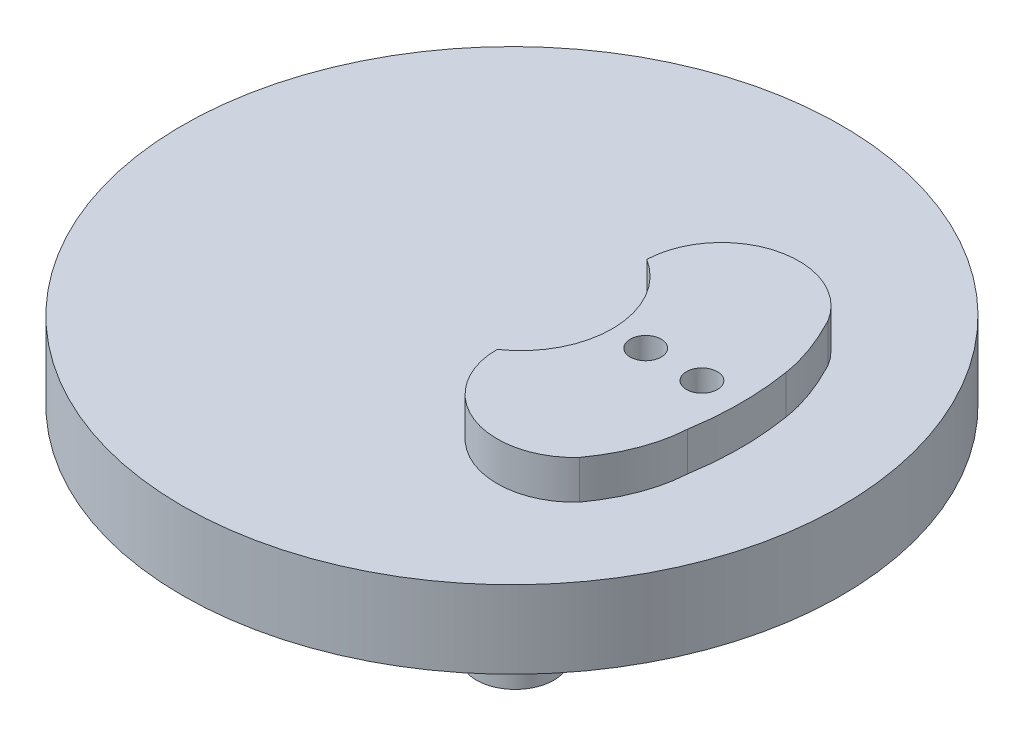
ISO-10303-21;
HEADER;
FILE_DESCRIPTION(('STEP AP214'),'2;1');
FILE_NAME('part.step','',(''),(''),'','','');
FILE_SCHEMA(('AUTOMOTIVE_DESIGN { 1 0 10303 214 1 1 1 1 }'));
ENDSEC;
DATA;
#1=APPLICATION_CONTEXT('core data for automotive mechanical design processes');
#2=APPLICATION_PROTOCOL_DEFINITION('international standard','automotive_design',2000,#1);
#3=PRODUCT_CONTEXT('',#1,'mechanical');
#4=PRODUCT('Part','Part','',(#3));
#5=PRODUCT_RELATED_PRODUCT_CATEGORY('part','',(#4));
#6=PRODUCT_DEFINITION_FORMATION('','',#4);
#7=PRODUCT_DEFINITION_CONTEXT('part definition',#1,'design');
#8=PRODUCT_DEFINITION('design','',#6,#7);
#9=PRODUCT_DEFINITION_SHAPE('','',#8);
#10=(LENGTH_UNIT() NAMED_UNIT(*) SI_UNIT(.MILLI.,.METRE.));
#11=(NAMED_UNIT(*) PLANE_ANGLE_UNIT() SI_UNIT($,.RADIAN.));
#12=(NAMED_UNIT(*) SI_UNIT($,.STERADIAN.) SOLID_ANGLE_UNIT());
#13=UNCERTAINTY_MEASURE_WITH_UNIT(LENGTH_MEASURE(1.E-05),#10,'distance_accuracy_value','');
#14=(GEOMETRIC_REPRESENTATION_CONTEXT(3) GLOBAL_UNCERTAINTY_ASSIGNED_CONTEXT((#13)) GLOBAL_UNIT_ASSIGNED_CONTEXT((#10,
#11,#12)) REPRESENTATION_CONTEXT('',''));
#15=CARTESIAN_POINT('',(0.,0.,0.));
#16=DIRECTION('',(0.,0.,1.));
#17=DIRECTION('',(1.,0.,0.));
#18=AXIS2_PLACEMENT_3D('',#15,#16,#17);
#19=CARTESIAN_POINT('',(0.,10.,0.));
#20=DIRECTION('',(0.,1.,0.));
#21=DIRECTION('',(0.,0.,1.));
#22=AXIS2_PLACEMENT_3D('',#19,#20,#21);
#23=PLANE('',#22);
#24=CARTESIAN_POINT('',(0.,10.,0.));
#25=DIRECTION('',(0.,1.,0.));
#26=DIRECTION('',(0.,0.,1.));
#27=AXIS2_PLACEMENT_3D('',#24,#25,#26);
#28=CIRCLE('',#27,42.5);
#29=CARTESIAN_POINT('',(0.,10.,42.5));
#30=VERTEX_POINT('',#29);
#31=EDGE_CURVE('E206',#30,#30,#28,.T.);
#32=ORIENTED_EDGE('',*,*,#31,.T.);
#33=EDGE_LOOP('',(#32));
#34=FACE_BOUND('',#33,.T.);
#35=CARTESIAN_POINT('',(29.,10.,6.35));
#36=CARTESIAN_POINT('',(28.6990503841167,10.,11.6004540782716));
#37=CARTESIAN_POINT('',(25.1780473542711,10.,16.4865917587496));
#38=B_SPLINE_CURVE_WITH_KNOTS('',2,(#35,#36,#37),.UNSPECIFIED.,.F.,.F.,(3,3),(0.672682650204616,
1.),.UNSPECIFIED.);
#39=CARTESIAN_POINT('',(29.,10.,6.35));
#40=VERTEX_POINT('',#39);
#41=CARTESIAN_POINT('',(25.1780473542711,10.,16.4865917587496));
#42=VERTEX_POINT('',#41);
#43=EDGE_CURVE('E142',#40,#42,#38,.T.);
#44=ORIENTED_EDGE('',*,*,#43,.T.);
#45=CARTESIAN_POINT('',(17.8151445831458,10.,9.71993358924264));
#46=DIRECTION('',(0.,1.,0.));
#47=DIRECTION('',(0.,0.,1.));
#48=AXIS2_PLACEMENT_3D('',#45,#46,#47);
#49=CIRCLE('',#48,9.99999999999999);
#50=CARTESIAN_POINT('',(7.81514458314579,10.,9.71993358924264));
#51=VERTEX_POINT('',#50);
#52=EDGE_CURVE('E174',#51,#42,#49,.T.);
#53=ORIENTED_EDGE('',*,*,#52,.F.);
#54=CARTESIAN_POINT('',(1.16155873490869,10.,0.));
#55=DIRECTION('',(0.,1.,0.));
#56=DIRECTION('',(0.,0.,1.));
#57=AXIS2_PLACEMENT_3D('',#54,#55,#56);
#58=CIRCLE('',#57,11.7791049583213);
#59=CARTESIAN_POINT('',(7.41061008423523,10.,-9.98482202408379));
#60=VERTEX_POINT('',#59);
#61=EDGE_CURVE('E61',#51,#60,#58,.T.);
#62=ORIENTED_EDGE('',*,*,#61,.T.);
#63=CARTESIAN_POINT('',(17.403624831824,10.,-9.61111591700208));
#64=DIRECTION('',(0.,1.,0.));
#65=DIRECTION('',(0.,0.,1.));
#66=AXIS2_PLACEMENT_3D('',#63,#64,#65);
#67=CIRCLE('',#66,9.99999999999982);
#68=CARTESIAN_POINT('',(25.955774389859,10.,-14.7938505172878));
#69=VERTEX_POINT('',#68);
#70=EDGE_CURVE('E122',#69,#60,#67,.T.);
#71=ORIENTED_EDGE('',*,*,#70,.F.);
#72=CARTESIAN_POINT('',(25.9557743898593,10.,-14.7938505172879));
#73=CARTESIAN_POINT('',(27.3295364248855,10.,-12.1453080062289));
#74=CARTESIAN_POINT('',(28.5408611416074,10.,-9.3136069401987));
#75=CARTESIAN_POINT('',(29.,10.,-6.35));
#76=B_SPLINE_CURVE_WITH_KNOTS('',3,(#72,#73,#74,#75),.UNSPECIFIED.,.F.,.F.,(4,4),(0.,
0.277553495444248),.UNSPECIFIED.);
#77=CARTESIAN_POINT('',(29.,10.,-6.35));
#78=VERTEX_POINT('',#77);
#79=EDGE_CURVE('E158',#69,#78,#76,.T.);
#80=ORIENTED_EDGE('',*,*,#79,.T.);
#81=CARTESIAN_POINT('',(29.,10.,-6.35));
#82=CARTESIAN_POINT('',(30.0422721438966,10.,0.));
#83=CARTESIAN_POINT('',(29.,10.,6.35));
#84=B_SPLINE_CURVE_WITH_KNOTS('',2,(#81,#82,#83),.UNSPECIFIED.,.F.,.F.,(3,3),(0.,1.),.UNSPECIFIED.);
#85=EDGE_CURVE('E148',#78,#40,#84,.T.);
#86=ORIENTED_EDGE('',*,*,#85,.T.);
#87=EDGE_LOOP('',(#44,#53,#62,#71,#80,#86));
#88=FACE_BOUND('',#87,.T.);
#89=ADVANCED_FACE('F45',(#34,#88),#23,.T.);
#90=CARTESIAN_POINT('',(0.,10.,0.));
#91=DIRECTION('',(0.,-1.,0.));
#92=DIRECTION('',(0.,0.,-1.));
#93=AXIS2_PLACEMENT_3D('',#90,#91,#92);
#94=CYLINDRICAL_SURFACE('',#93,42.5);
#95=ORIENTED_EDGE('',*,*,#31,.F.);
#96=EDGE_LOOP('',(#95));
#97=FACE_BOUND('',#96,.T.);
#98=CARTESIAN_POINT('',(0.,0.,0.));
#99=DIRECTION('',(0.,1.,0.));
#100=DIRECTION('',(0.,0.,1.));
#101=AXIS2_PLACEMENT_3D('',#98,#99,#100);
#102=CIRCLE('',#101,42.5);
#103=CARTESIAN_POINT('',(0.,0.,42.5));
#104=VERTEX_POINT('',#103);
#105=EDGE_CURVE('E205',#104,#104,#102,.T.);
#106=ORIENTED_EDGE('',*,*,#105,.T.);
#107=EDGE_LOOP('',(#106));
#108=FACE_BOUND('',#107,.T.);
#109=ADVANCED_FACE('F47',(#97,#108),#94,.T.);
#110=CARTESIAN_POINT('',(0.,0.,0.));
#111=DIRECTION('',(0.,1.,0.));
#112=DIRECTION('',(0.,0.,1.));
#113=AXIS2_PLACEMENT_3D('',#110,#111,#112);
#114=PLANE('',#113);
#115=CARTESIAN_POINT('',(24.5,0.,3.02492406123456E-12));
#116=DIRECTION('',(0.,1.,0.));
#117=DIRECTION('',(0.,0.,1.));
#118=AXIS2_PLACEMENT_3D('',#115,#116,#117);
#119=CIRCLE('',#118,2.00000000000089);
#120=CARTESIAN_POINT('',(24.5,0.,2.00000000000391));
#121=VERTEX_POINT('',#120);
#122=EDGE_CURVE('E513',#121,#121,#119,.T.);
#123=ORIENTED_EDGE('',*,*,#122,.T.);
#124=EDGE_LOOP('',(#123));
#125=FACE_BOUND('',#124,.T.);
#126=CARTESIAN_POINT('',(17.25,0.,0.));
#127=DIRECTION('',(0.,1.,0.));
#128=DIRECTION('',(0.,0.,1.));
#129=AXIS2_PLACEMENT_3D('',#126,#127,#128);
#130=CIRCLE('',#129,2.);
#131=CARTESIAN_POINT('',(17.25,0.,2.));
#132=VERTEX_POINT('',#131);
#133=EDGE_CURVE('E149',#132,#132,#130,.T.);
#134=ORIENTED_EDGE('',*,*,#133,.T.);
#135=EDGE_LOOP('',(#134));
#136=FACE_BOUND('',#135,.T.);
#137=CARTESIAN_POINT('',(-21.4210153985787,0.,-21.0033354325892));
#138=DIRECTION('',(0.,1.,0.));
#139=DIRECTION('',(0.,0.,1.));
#140=AXIS2_PLACEMENT_3D('',#137,#138,#139);
#141=CIRCLE('',#140,5.);
#142=CARTESIAN_POINT('',(-21.4210153985787,0.,-16.0033354325892));
#143=VERTEX_POINT('',#142);
#144=EDGE_CURVE('E11',#143,#143,#141,.F.);
#145=ORIENTED_EDGE('',*,*,#144,.F.);
#146=EDGE_LOOP('',(#145));
#147=FACE_BOUND('',#146,.T.);
#148=CARTESIAN_POINT('',(-21.0033354325894,0.,21.4210153985784));
#149=DIRECTION('',(0.,1.,0.));
#150=DIRECTION('',(0.,0.,1.));
#151=AXIS2_PLACEMENT_3D('',#148,#149,#150);
#152=CIRCLE('',#151,5.);
#153=CARTESIAN_POINT('',(-21.0033354325894,0.,26.4210153985784));
#154=VERTEX_POINT('',#153);
#155=EDGE_CURVE('E54',#154,#154,#152,.F.);
#156=ORIENTED_EDGE('',*,*,#155,.F.);
#157=EDGE_LOOP('',(#156));
#158=FACE_BOUND('',#157,.T.);
#159=CARTESIAN_POINT('',(21.0033354325892,0.,-21.4210153985786));
#160=DIRECTION('',(0.,1.,0.));
#161=DIRECTION('',(0.,0.,1.));
#162=AXIS2_PLACEMENT_3D('',#159,#160,#161);
#163=CIRCLE('',#162,5.);
#164=CARTESIAN_POINT('',(21.0033354325892,0.,-16.4210153985786));
#165=VERTEX_POINT('',#164);
#166=EDGE_CURVE('E217',#165,#165,#163,.F.);
#167=ORIENTED_EDGE('',*,*,#166,.F.);
#168=EDGE_LOOP('',(#167));
#169=FACE_BOUND('',#168,.T.);
#170=CARTESIAN_POINT('',(21.4210153985785,0.,21.0033354325893));
#171=DIRECTION('',(0.,1.,0.));
#172=DIRECTION('',(0.,0.,1.));
#173=AXIS2_PLACEMENT_3D('',#170,#171,#172);
#174=CIRCLE('',#173,5.);
#175=CARTESIAN_POINT('',(21.4210153985785,0.,26.0033354325893));
#176=VERTEX_POINT('',#175);
#177=EDGE_CURVE('E210',#176,#176,#174,.F.);
#178=ORIENTED_EDGE('',*,*,#177,.F.);
#179=EDGE_LOOP('',(#178));
#180=FACE_BOUND('',#179,.T.);
#181=ORIENTED_EDGE('',*,*,#105,.F.);
#182=EDGE_LOOP('',(#181));
#183=FACE_BOUND('',#182,.T.);
#184=ADVANCED_FACE('F226',(#125,#136,#147,#158,#169,#180,#183),#114,.F.);
#185=CARTESIAN_POINT('',(21.4210153985785,-7.,21.0033354325893));
#186=DIRECTION('',(0.,1.,0.));
#187=DIRECTION('',(0.,0.,1.));
#188=AXIS2_PLACEMENT_3D('',#185,#186,#187);
#189=CYLINDRICAL_SURFACE('',#188,5.);
#190=CARTESIAN_POINT('',(21.4210153985785,-7.,21.0033354325893));
#191=DIRECTION('',(0.,-1.,0.));
#192=DIRECTION('',(0.,0.,-1.));
#193=AXIS2_PLACEMENT_3D('',#190,#191,#192);
#194=CIRCLE('',#193,5.);
#195=CARTESIAN_POINT('',(21.4210153985785,-7.,16.0033354325893));
#196=VERTEX_POINT('',#195);
#197=EDGE_CURVE('E201',#196,#196,#194,.T.);
#198=ORIENTED_EDGE('',*,*,#197,.F.);
#199=EDGE_LOOP('',(#198));
#200=FACE_BOUND('',#199,.T.);
#201=ORIENTED_EDGE('',*,*,#177,.T.);
#202=EDGE_LOOP('',(#201));
#203=FACE_BOUND('',#202,.T.);
#204=ADVANCED_FACE('F229',(#200,#203),#189,.T.);
#205=CARTESIAN_POINT('',(21.4210153985785,-7.,21.0033354325893));
#206=DIRECTION('',(0.,-1.,0.));
#207=DIRECTION('',(0.,0.,-1.));
#208=AXIS2_PLACEMENT_3D('',#205,#206,#207);
#209=PLANE('',#208);
#210=ORIENTED_EDGE('',*,*,#197,.T.);
#211=EDGE_LOOP('',(#210));
#212=FACE_BOUND('',#211,.T.);
#213=ADVANCED_FACE('F413',(#212),#209,.T.);
#214=CARTESIAN_POINT('',(21.0033354325892,-7.,-21.4210153985786));
#215=DIRECTION('',(0.,1.,0.));
#216=DIRECTION('',(0.,0.,1.));
#217=AXIS2_PLACEMENT_3D('',#214,#215,#216);
#218=CYLINDRICAL_SURFACE('',#217,5.);
#219=CARTESIAN_POINT('',(21.0033354325892,-7.,-21.4210153985786));
#220=DIRECTION('',(0.,-1.,0.));
#221=DIRECTION('',(0.,0.,-1.));
#222=AXIS2_PLACEMENT_3D('',#219,#220,#221);
#223=CIRCLE('',#222,5.);
#224=CARTESIAN_POINT('',(21.0033354325892,-7.,-26.4210153985786));
#225=VERTEX_POINT('',#224);
#226=EDGE_CURVE('E197',#225,#225,#223,.T.);
#227=ORIENTED_EDGE('',*,*,#226,.F.);
#228=EDGE_LOOP('',(#227));
#229=FACE_BOUND('',#228,.T.);
#230=ORIENTED_EDGE('',*,*,#166,.T.);
#231=EDGE_LOOP('',(#230));
#232=FACE_BOUND('',#231,.T.);
#233=ADVANCED_FACE('F402',(#229,#232),#218,.T.);
#234=CARTESIAN_POINT('',(21.0033354325892,-7.,-21.4210153985786));
#235=DIRECTION('',(0.,-1.,0.));
#236=DIRECTION('',(0.,0.,-1.));
#237=AXIS2_PLACEMENT_3D('',#234,#235,#236);
#238=PLANE('',#237);
#239=ORIENTED_EDGE('',*,*,#226,.T.);
#240=EDGE_LOOP('',(#239));
#241=FACE_BOUND('',#240,.T.);
#242=ADVANCED_FACE('F391',(#241),#238,.T.);
#243=CARTESIAN_POINT('',(-21.0033354325894,-7.,21.4210153985784));
#244=DIRECTION('',(0.,1.,0.));
#245=DIRECTION('',(0.,0.,1.));
#246=AXIS2_PLACEMENT_3D('',#243,#244,#245);
#247=CYLINDRICAL_SURFACE('',#246,5.);
#248=CARTESIAN_POINT('',(-21.0033354325894,-7.,21.4210153985784));
#249=DIRECTION('',(0.,-1.,0.));
#250=DIRECTION('',(0.,0.,-1.));
#251=AXIS2_PLACEMENT_3D('',#248,#249,#250);
#252=CIRCLE('',#251,5.);
#253=CARTESIAN_POINT('',(-21.0033354325894,-7.,16.4210153985784));
#254=VERTEX_POINT('',#253);
#255=EDGE_CURVE('E193',#254,#254,#252,.T.);
#256=ORIENTED_EDGE('',*,*,#255,.F.);
#257=EDGE_LOOP('',(#256));
#258=FACE_BOUND('',#257,.T.);
#259=ORIENTED_EDGE('',*,*,#155,.T.);
#260=EDGE_LOOP('',(#259));
#261=FACE_BOUND('',#260,.T.);
#262=ADVANCED_FACE('F224',(#258,#261),#247,.T.);
#263=CARTESIAN_POINT('',(-21.0033354325894,-7.,21.4210153985784));
#264=DIRECTION('',(0.,-1.,0.));
#265=DIRECTION('',(0.,0.,-1.));
#266=AXIS2_PLACEMENT_3D('',#263,#264,#265);
#267=PLANE('',#266);
#268=ORIENTED_EDGE('',*,*,#255,.T.);
#269=EDGE_LOOP('',(#268));
#270=FACE_BOUND('',#269,.T.);
#271=ADVANCED_FACE('F371',(#270),#267,.T.);
#272=CARTESIAN_POINT('',(-21.4210153985787,-7.,-21.0033354325892));
#273=DIRECTION('',(0.,1.,0.));
#274=DIRECTION('',(0.,0.,1.));
#275=AXIS2_PLACEMENT_3D('',#272,#273,#274);
#276=CYLINDRICAL_SURFACE('',#275,5.);
#277=CARTESIAN_POINT('',(-21.4210153985787,-7.,-21.0033354325892));
#278=DIRECTION('',(0.,-1.,0.));
#279=DIRECTION('',(0.,0.,-1.));
#280=AXIS2_PLACEMENT_3D('',#277,#278,#279);
#281=CIRCLE('',#280,5.);
#282=CARTESIAN_POINT('',(-21.4210153985787,-7.,-26.0033354325892));
#283=VERTEX_POINT('',#282);
#284=EDGE_CURVE('E189',#283,#283,#281,.T.);
#285=ORIENTED_EDGE('',*,*,#284,.F.);
#286=EDGE_LOOP('',(#285));
#287=FACE_BOUND('',#286,.T.);
#288=ORIENTED_EDGE('',*,*,#144,.T.);
#289=EDGE_LOOP('',(#288));
#290=FACE_BOUND('',#289,.T.);
#291=ADVANCED_FACE('F260',(#287,#290),#276,.T.);
#292=CARTESIAN_POINT('',(-21.4210153985787,-7.,-21.0033354325892));
#293=DIRECTION('',(0.,-1.,0.));
#294=DIRECTION('',(0.,0.,-1.));
#295=AXIS2_PLACEMENT_3D('',#292,#293,#294);
#296=PLANE('',#295);
#297=ORIENTED_EDGE('',*,*,#284,.T.);
#298=EDGE_LOOP('',(#297));
#299=FACE_BOUND('',#298,.T.);
#300=ADVANCED_FACE('F251',(#299),#296,.T.);
#301=CARTESIAN_POINT('',(29.,15.,6.35));
#302=CARTESIAN_POINT('',(28.6990503841167,15.,11.6004540782716));
#303=CARTESIAN_POINT('',(25.1780473542711,15.,16.4865917587496));
#304=B_SPLINE_CURVE_WITH_KNOTS('',2,(#301,#302,#303),.UNSPECIFIED.,.F.,.F.,(3,3),
(0.672682650204616,1.),.UNSPECIFIED.);
#305=DIRECTION('',(0.,-1.,0.));
#306=VECTOR('',#305,1.);
#307=SURFACE_OF_LINEAR_EXTRUSION('',#304,#306);
#308=ORIENTED_EDGE('',*,*,#43,.F.);
#309=DIRECTION('',(0.,-1.,0.));
#310=VECTOR('',#309,1.);
#311=CARTESIAN_POINT('',(29.,15.,6.35));
#312=LINE('',#311,#310);
#313=CARTESIAN_POINT('',(29.,15.,6.35));
#314=VERTEX_POINT('',#313);
#315=EDGE_CURVE('E97',#314,#40,#312,.T.);
#316=ORIENTED_EDGE('',*,*,#315,.F.);
#317=CARTESIAN_POINT('',(25.1780473542711,15.,16.4865917587496));
#318=VERTEX_POINT('',#317);
#319=EDGE_CURVE('E177',#314,#318,#304,.T.);
#320=ORIENTED_EDGE('',*,*,#319,.T.);
#321=DIRECTION('',(0.,-1.,0.));
#322=VECTOR('',#321,1.);
#323=CARTESIAN_POINT('',(25.1780473542711,15.,16.4865917587496));
#324=LINE('',#323,#322);
#325=EDGE_CURVE('E92',#318,#42,#324,.T.);
#326=ORIENTED_EDGE('',*,*,#325,.T.);
#327=EDGE_LOOP('',(#308,#316,#320,#326));
#328=FACE_BOUND('',#327,.T.);
#329=ADVANCED_FACE('F248',(#328),#307,.T.);
#330=CARTESIAN_POINT('',(29.,15.,-6.35));
#331=CARTESIAN_POINT('',(30.0422721438966,15.,0.));
#332=CARTESIAN_POINT('',(29.,15.,6.35));
#333=B_SPLINE_CURVE_WITH_KNOTS('',2,(#330,#331,#332),.UNSPECIFIED.,.F.,.F.,(3,3),(0.,1.),.UNSPECIFIED.);
#334=DIRECTION('',(0.,-1.,0.));
#335=VECTOR('',#334,1.);
#336=SURFACE_OF_LINEAR_EXTRUSION('',#333,#335);
#337=ORIENTED_EDGE('',*,*,#85,.F.);
#338=DIRECTION('',(0.,-1.,0.));
#339=VECTOR('',#338,1.);
#340=CARTESIAN_POINT('',(29.,15.,-6.35));
#341=LINE('',#340,#339);
#342=CARTESIAN_POINT('',(29.,15.,-6.35));
#343=VERTEX_POINT('',#342);
#344=EDGE_CURVE('E184',#343,#78,#341,.T.);
#345=ORIENTED_EDGE('',*,*,#344,.F.);
#346=EDGE_CURVE('E272',#343,#314,#333,.T.);
#347=ORIENTED_EDGE('',*,*,#346,.T.);
#348=ORIENTED_EDGE('',*,*,#315,.T.);
#349=EDGE_LOOP('',(#337,#345,#347,#348));
#350=FACE_BOUND('',#349,.T.);
#351=ADVANCED_FACE('F250',(#350),#336,.T.);
#352=CARTESIAN_POINT('',(25.9557743898593,15.,-14.7938505172879));
#353=CARTESIAN_POINT('',(27.3295364248855,15.,-12.1453080062289));
#354=CARTESIAN_POINT('',(28.5408611416074,15.,-9.3136069401987));
#355=CARTESIAN_POINT('',(29.,15.,-6.35));
#356=B_SPLINE_CURVE_WITH_KNOTS('',3,(#352,#353,#354,#355),.UNSPECIFIED.,.F.,.F.,(4,4),(0.,
0.277553495444248),.UNSPECIFIED.);
#357=DIRECTION('',(0.,-1.,0.));
#358=VECTOR('',#357,1.);
#359=SURFACE_OF_LINEAR_EXTRUSION('',#356,#358);
#360=ORIENTED_EDGE('',*,*,#79,.F.);
#361=DIRECTION('',(0.,-1.,0.));
#362=VECTOR('',#361,1.);
#363=CARTESIAN_POINT('',(25.955774389859,15.,-14.7938505172878));
#364=LINE('',#363,#362);
#365=CARTESIAN_POINT('',(25.955774389859,15.,-14.7938505172878));
#366=VERTEX_POINT('',#365);
#367=EDGE_CURVE('E124',#366,#69,#364,.T.);
#368=ORIENTED_EDGE('',*,*,#367,.F.);
#369=EDGE_CURVE('E114',#366,#343,#356,.T.);
#370=ORIENTED_EDGE('',*,*,#369,.T.);
#371=ORIENTED_EDGE('',*,*,#344,.T.);
#372=EDGE_LOOP('',(#360,#368,#370,#371));
#373=FACE_BOUND('',#372,.T.);
#374=ADVANCED_FACE('F257',(#373),#359,.T.);
#375=CARTESIAN_POINT('',(17.403624831824,15.,-9.61111591700208));
#376=DIRECTION('',(0.,-1.,0.));
#377=DIRECTION('',(0.,0.,-1.));
#378=AXIS2_PLACEMENT_3D('',#375,#376,#377);
#379=CYLINDRICAL_SURFACE('',#378,9.99999999999982);
#380=ORIENTED_EDGE('',*,*,#70,.T.);
#381=DIRECTION('',(0.,-1.,0.));
#382=VECTOR('',#381,1.);
#383=CARTESIAN_POINT('',(7.41061008423523,15.,-9.98482202408379));
#384=LINE('',#383,#382);
#385=CARTESIAN_POINT('',(7.41061008423523,15.,-9.98482202408379));
#386=VERTEX_POINT('',#385);
#387=EDGE_CURVE('E119',#386,#60,#384,.T.);
#388=ORIENTED_EDGE('',*,*,#387,.F.);
#389=CARTESIAN_POINT('',(17.403624831824,15.,-9.61111591700208));
#390=DIRECTION('',(0.,1.,0.));
#391=DIRECTION('',(0.,0.,1.));
#392=AXIS2_PLACEMENT_3D('',#389,#390,#391);
#393=CIRCLE('',#392,9.99999999999982);
#394=EDGE_CURVE('E106',#366,#386,#393,.T.);
#395=ORIENTED_EDGE('',*,*,#394,.F.);
#396=ORIENTED_EDGE('',*,*,#367,.T.);
#397=EDGE_LOOP('',(#380,#388,#395,#396));
#398=FACE_BOUND('',#397,.T.);
#399=ADVANCED_FACE('F120',(#398),#379,.T.);
#400=CARTESIAN_POINT('',(1.16155873490869,15.,0.));
#401=DIRECTION('',(0.,-1.,0.));
#402=DIRECTION('',(0.,0.,-1.));
#403=AXIS2_PLACEMENT_3D('',#400,#401,#402);
#404=CYLINDRICAL_SURFACE('',#403,11.7791049583213);
#405=ORIENTED_EDGE('',*,*,#61,.F.);
#406=DIRECTION('',(0.,-1.,0.));
#407=VECTOR('',#406,1.);
#408=CARTESIAN_POINT('',(7.81514458314579,15.,9.71993358924264));
#409=LINE('',#408,#407);
#410=CARTESIAN_POINT('',(7.81514458314579,15.,9.71993358924264));
#411=VERTEX_POINT('',#410);
#412=EDGE_CURVE('E125',#411,#51,#409,.T.);
#413=ORIENTED_EDGE('',*,*,#412,.F.);
#414=CARTESIAN_POINT('',(1.16155873490869,15.,0.));
#415=DIRECTION('',(0.,1.,0.));
#416=DIRECTION('',(0.,0.,1.));
#417=AXIS2_PLACEMENT_3D('',#414,#415,#416);
#418=CIRCLE('',#417,11.7791049583213);
#419=EDGE_CURVE('E111',#411,#386,#418,.T.);
#420=ORIENTED_EDGE('',*,*,#419,.T.);
#421=ORIENTED_EDGE('',*,*,#387,.T.);
#422=EDGE_LOOP('',(#405,#413,#420,#421));
#423=FACE_BOUND('',#422,.T.);
#424=ADVANCED_FACE('F127',(#423),#404,.F.);
#425=CARTESIAN_POINT('',(24.5,15.,3.02492406123456E-12));
#426=DIRECTION('',(0.,-1.,0.));
#427=DIRECTION('',(0.,0.,-1.));
#428=AXIS2_PLACEMENT_3D('',#425,#426,#427);
#429=CYLINDRICAL_SURFACE('',#428,2.00000000000089);
#430=CARTESIAN_POINT('',(24.5,15.,3.02492406123456E-12));
#431=DIRECTION('',(0.,1.,0.));
#432=DIRECTION('',(0.,0.,1.));
#433=AXIS2_PLACEMENT_3D('',#430,#431,#432);
#434=CIRCLE('',#433,2.00000000000089);
#435=CARTESIAN_POINT('',(24.5,15.,2.00000000000391));
#436=VERTEX_POINT('',#435);
#437=EDGE_CURVE('E131',#436,#436,#434,.T.);
#438=ORIENTED_EDGE('',*,*,#437,.T.);
#439=EDGE_LOOP('',(#438));
#440=FACE_BOUND('',#439,.T.);
#441=ORIENTED_EDGE('',*,*,#122,.F.);
#442=EDGE_LOOP('',(#441));
#443=FACE_BOUND('',#442,.T.);
#444=ADVANCED_FACE('F299',(#440,#443),#429,.F.);
#445=CARTESIAN_POINT('',(17.8151445831458,15.,9.71993358924264));
#446=DIRECTION('',(0.,-1.,0.));
#447=DIRECTION('',(0.,0.,-1.));
#448=AXIS2_PLACEMENT_3D('',#445,#446,#447);
#449=CYLINDRICAL_SURFACE('',#448,9.99999999999999);
#450=ORIENTED_EDGE('',*,*,#52,.T.);
#451=ORIENTED_EDGE('',*,*,#325,.F.);
#452=CARTESIAN_POINT('',(17.8151445831458,15.,9.71993358924264));
#453=DIRECTION('',(0.,1.,0.));
#454=DIRECTION('',(0.,0.,1.));
#455=AXIS2_PLACEMENT_3D('',#452,#453,#454);
#456=CIRCLE('',#455,9.99999999999999);
#457=EDGE_CURVE('E70',#411,#318,#456,.T.);
#458=ORIENTED_EDGE('',*,*,#457,.F.);
#459=ORIENTED_EDGE('',*,*,#412,.T.);
#460=EDGE_LOOP('',(#450,#451,#458,#459));
#461=FACE_BOUND('',#460,.T.);
#462=ADVANCED_FACE('F300',(#461),#449,.T.);
#463=CARTESIAN_POINT('',(17.25,15.,0.));
#464=DIRECTION('',(0.,-1.,0.));
#465=DIRECTION('',(0.,0.,-1.));
#466=AXIS2_PLACEMENT_3D('',#463,#464,#465);
#467=CYLINDRICAL_SURFACE('',#466,2.);
#468=CARTESIAN_POINT('',(17.25,15.,0.));
#469=DIRECTION('',(0.,1.,0.));
#470=DIRECTION('',(0.,0.,1.));
#471=AXIS2_PLACEMENT_3D('',#468,#469,#470);
#472=CIRCLE('',#471,2.);
#473=CARTESIAN_POINT('',(17.25,15.,2.));
#474=VERTEX_POINT('',#473);
#475=EDGE_CURVE('E138',#474,#474,#472,.T.);
#476=ORIENTED_EDGE('',*,*,#475,.T.);
#477=EDGE_LOOP('',(#476));
#478=FACE_BOUND('',#477,.T.);
#479=ORIENTED_EDGE('',*,*,#133,.F.);
#480=EDGE_LOOP('',(#479));
#481=FACE_BOUND('',#480,.T.);
#482=ADVANCED_FACE('F303',(#478,#481),#467,.F.);
#483=CARTESIAN_POINT('',(0.,15.,0.));
#484=DIRECTION('',(0.,1.,0.));
#485=DIRECTION('',(0.,0.,1.));
#486=AXIS2_PLACEMENT_3D('',#483,#484,#485);
#487=PLANE('',#486);
#488=ORIENTED_EDGE('',*,*,#319,.F.);
#489=ORIENTED_EDGE('',*,*,#346,.F.);
#490=ORIENTED_EDGE('',*,*,#369,.F.);
#491=ORIENTED_EDGE('',*,*,#394,.T.);
#492=ORIENTED_EDGE('',*,*,#419,.F.);
#493=ORIENTED_EDGE('',*,*,#457,.T.);
#494=EDGE_LOOP('',(#488,#489,#490,#491,#492,#493));
#495=FACE_BOUND('',#494,.T.);
#496=ORIENTED_EDGE('',*,*,#437,.F.);
#497=EDGE_LOOP('',(#496));
#498=FACE_BOUND('',#497,.T.);
#499=ORIENTED_EDGE('',*,*,#475,.F.);
#500=EDGE_LOOP('',(#499));
#501=FACE_BOUND('',#500,.T.);
#502=ADVANCED_FACE('F108',(#495,#498,#501),#487,.T.);
#503=CLOSED_SHELL('',(#89,#109,#184,#204,#213,#233,#242,#262,#271,#291,#300,#329,#351,#374,#399,
#424,#444,#462,#482,#502));
#504=MANIFOLD_SOLID_BREP('B2',#503);
#505=ADVANCED_BREP_SHAPE_REPRESENTATION('',(#18,#504),#14);
#506=SHAPE_DEFINITION_REPRESENTATION(#9,#505);
ENDSEC;
END-ISO-10303-21;
